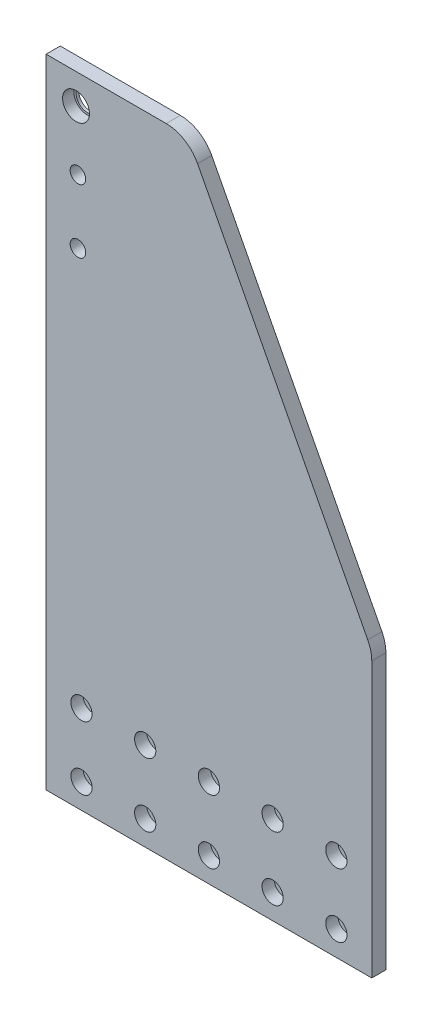
ISO-10303-21;
HEADER;
FILE_DESCRIPTION(('STEP AP214'),'2;1');
FILE_NAME('part.step','',(''),(''),'','','');
FILE_SCHEMA(('AUTOMOTIVE_DESIGN { 1 0 10303 214 1 1 1 1 }'));
ENDSEC;
DATA;
#1=APPLICATION_CONTEXT('core data for automotive mechanical design processes');
#2=APPLICATION_PROTOCOL_DEFINITION('international standard','automotive_design',2000,#1);
#3=PRODUCT_CONTEXT('',#1,'mechanical');
#4=PRODUCT('Part','Part','',(#3));
#5=PRODUCT_RELATED_PRODUCT_CATEGORY('part','',(#4));
#6=PRODUCT_DEFINITION_FORMATION('','',#4);
#7=PRODUCT_DEFINITION_CONTEXT('part definition',#1,'design');
#8=PRODUCT_DEFINITION('design','',#6,#7);
#9=PRODUCT_DEFINITION_SHAPE('','',#8);
#10=(LENGTH_UNIT() NAMED_UNIT(*) SI_UNIT(.MILLI.,.METRE.));
#11=(NAMED_UNIT(*) PLANE_ANGLE_UNIT() SI_UNIT($,.RADIAN.));
#12=(NAMED_UNIT(*) SI_UNIT($,.STERADIAN.) SOLID_ANGLE_UNIT());
#13=UNCERTAINTY_MEASURE_WITH_UNIT(LENGTH_MEASURE(1.E-05),#10,'distance_accuracy_value','');
#14=(GEOMETRIC_REPRESENTATION_CONTEXT(3) GLOBAL_UNCERTAINTY_ASSIGNED_CONTEXT((#13)) GLOBAL_UNIT_ASSIGNED_CONTEXT((#10,
#11,#12)) REPRESENTATION_CONTEXT('',''));
#15=CARTESIAN_POINT('',(0.,0.,0.));
#16=DIRECTION('',(0.,0.,1.));
#17=DIRECTION('',(1.,0.,0.));
#18=AXIS2_PLACEMENT_3D('',#15,#16,#17);
#19=CARTESIAN_POINT('',(-115.,0.,5.));
#20=DIRECTION('',(0.,1.,0.));
#21=DIRECTION('',(0.,0.,1.));
#22=AXIS2_PLACEMENT_3D('',#19,#20,#21);
#23=PLANE('',#22);
#24=DIRECTION('',(1.,0.,0.));
#25=VECTOR('',#24,1.);
#26=CARTESIAN_POINT('',(-115.,0.,-5.));
#27=LINE('',#26,#25);
#28=CARTESIAN_POINT('',(-115.,0.,-5.));
#29=VERTEX_POINT('',#28);
#30=CARTESIAN_POINT('',(115.,0.,-5.));
#31=VERTEX_POINT('',#30);
#32=EDGE_CURVE('E120',#29,#31,#27,.T.);
#33=ORIENTED_EDGE('',*,*,#32,.T.);
#34=DIRECTION('',(0.,0.,-1.));
#35=VECTOR('',#34,1.);
#36=CARTESIAN_POINT('',(115.,0.,5.));
#37=LINE('',#36,#35);
#38=CARTESIAN_POINT('',(115.,0.,5.));
#39=VERTEX_POINT('',#38);
#40=EDGE_CURVE('E104',#39,#31,#37,.T.);
#41=ORIENTED_EDGE('',*,*,#40,.F.);
#42=DIRECTION('',(1.,0.,0.));
#43=VECTOR('',#42,1.);
#44=CARTESIAN_POINT('',(-115.,0.,5.));
#45=LINE('',#44,#43);
#46=CARTESIAN_POINT('',(-115.,0.,5.));
#47=VERTEX_POINT('',#46);
#48=EDGE_CURVE('E108',#47,#39,#45,.T.);
#49=ORIENTED_EDGE('',*,*,#48,.F.);
#50=DIRECTION('',(0.,0.,-1.));
#51=VECTOR('',#50,1.);
#52=CARTESIAN_POINT('',(-115.,0.,5.));
#53=LINE('',#52,#51);
#54=EDGE_CURVE('E127',#47,#29,#53,.T.);
#55=ORIENTED_EDGE('',*,*,#54,.T.);
#56=EDGE_LOOP('',(#33,#41,#49,#55));
#57=FACE_BOUND('',#56,.T.);
#58=ADVANCED_FACE('F39',(#57),#23,.F.);
#59=CARTESIAN_POINT('',(115.,200.,5.));
#60=DIRECTION('',(-1.,0.,0.));
#61=DIRECTION('',(0.,-1.,0.));
#62=AXIS2_PLACEMENT_3D('',#59,#60,#61);
#63=PLANE('',#62);
#64=DIRECTION('',(0.,1.,0.));
#65=VECTOR('',#64,1.);
#66=CARTESIAN_POINT('',(115.,200.,-5.));
#67=LINE('',#66,#65);
#68=CARTESIAN_POINT('',(115.,193.888450755364,-5.));
#69=VERTEX_POINT('',#68);
#70=EDGE_CURVE('E289',#31,#69,#67,.T.);
#71=ORIENTED_EDGE('',*,*,#70,.T.);
#72=DIRECTION('',(0.,0.,-1.));
#73=VECTOR('',#72,1.);
#74=CARTESIAN_POINT('',(115.,193.888450755364,5.));
#75=LINE('',#74,#73);
#76=CARTESIAN_POINT('',(115.,193.888450755364,5.));
#77=VERTEX_POINT('',#76);
#78=EDGE_CURVE('E64',#69,#77,#75,.F.);
#79=ORIENTED_EDGE('',*,*,#78,.T.);
#80=DIRECTION('',(0.,1.,0.));
#81=VECTOR('',#80,1.);
#82=CARTESIAN_POINT('',(115.,200.,5.));
#83=LINE('',#82,#81);
#84=EDGE_CURVE('E100',#39,#77,#83,.T.);
#85=ORIENTED_EDGE('',*,*,#84,.F.);
#86=ORIENTED_EDGE('',*,*,#40,.T.);
#87=EDGE_LOOP('',(#71,#79,#85,#86));
#88=FACE_BOUND('',#87,.T.);
#89=ADVANCED_FACE('F102',(#88),#63,.F.);
#90=CARTESIAN_POINT('',(115.,200.,5.));
#91=DIRECTION('',(-0.887216801234595,-0.46135273664199,0.));
#92=DIRECTION('',(0.46135273664199,-0.887216801234595,0.));
#93=AXIS2_PLACEMENT_3D('',#90,#91,#92);
#94=PLANE('',#93);
#95=DIRECTION('',(-0.46135273664199,0.887216801234595,0.));
#96=VECTOR('',#95,1.);
#97=CARTESIAN_POINT('',(115.,200.,5.));
#98=LINE('',#97,#96);
#99=CARTESIAN_POINT('',(112.180420030865,205.422269171414,5.));
#100=VERTEX_POINT('',#99);
#101=CARTESIAN_POINT('',(-7.99758557634587,436.53381841605,5.));
#102=VERTEX_POINT('',#101);
#103=EDGE_CURVE('E107',#100,#102,#98,.T.);
#104=ORIENTED_EDGE('',*,*,#103,.F.);
#105=DIRECTION('',(0.,0.,-1.));
#106=VECTOR('',#105,1.);
#107=CARTESIAN_POINT('',(112.180420030865,205.422269171414,5.));
#108=LINE('',#107,#106);
#109=CARTESIAN_POINT('',(112.180420030865,205.422269171414,-5.));
#110=VERTEX_POINT('',#109);
#111=EDGE_CURVE('E124',#100,#110,#108,.T.);
#112=ORIENTED_EDGE('',*,*,#111,.T.);
#113=DIRECTION('',(-0.46135273664199,0.887216801234595,0.));
#114=VECTOR('',#113,1.);
#115=CARTESIAN_POINT('',(115.,200.,-5.));
#116=LINE('',#115,#114);
#117=CARTESIAN_POINT('',(-7.99758557634587,436.53381841605,-5.));
#118=VERTEX_POINT('',#117);
#119=EDGE_CURVE('E291',#110,#118,#116,.T.);
#120=ORIENTED_EDGE('',*,*,#119,.T.);
#121=DIRECTION('',(0.,0.,-1.));
#122=VECTOR('',#121,1.);
#123=CARTESIAN_POINT('',(-7.99758557634593,436.53381841605,5.));
#124=LINE('',#123,#122);
#125=EDGE_CURVE('E121',#118,#102,#124,.F.);
#126=ORIENTED_EDGE('',*,*,#125,.T.);
#127=EDGE_LOOP('',(#104,#112,#120,#126));
#128=FACE_BOUND('',#127,.T.);
#129=ADVANCED_FACE('F307',(#128),#94,.F.);
#130=CARTESIAN_POINT('',(-15.0000000000001,450.,5.));
#131=DIRECTION('',(0.,-1.,0.));
#132=DIRECTION('',(0.,0.,-1.));
#133=AXIS2_PLACEMENT_3D('',#130,#131,#132);
#134=PLANE('',#133);
#135=DIRECTION('',(-1.,0.,0.));
#136=VECTOR('',#135,1.);
#137=CARTESIAN_POINT('',(-15.0000000000001,450.,5.));
#138=LINE('',#137,#136);
#139=CARTESIAN_POINT('',(-30.1780056072108,450.,5.));
#140=VERTEX_POINT('',#139);
#141=CARTESIAN_POINT('',(-115.,450.,5.));
#142=VERTEX_POINT('',#141);
#143=EDGE_CURVE('E285',#140,#142,#138,.T.);
#144=ORIENTED_EDGE('',*,*,#143,.F.);
#145=DIRECTION('',(0.,0.,-1.));
#146=VECTOR('',#145,1.);
#147=CARTESIAN_POINT('',(-30.1780056072108,450.,5.));
#148=LINE('',#147,#146);
#149=CARTESIAN_POINT('',(-30.1780056072108,450.,-5.));
#150=VERTEX_POINT('',#149);
#151=EDGE_CURVE('E11',#140,#150,#148,.T.);
#152=ORIENTED_EDGE('',*,*,#151,.T.);
#153=DIRECTION('',(-1.,0.,0.));
#154=VECTOR('',#153,1.);
#155=CARTESIAN_POINT('',(-15.0000000000001,450.,-5.));
#156=LINE('',#155,#154);
#157=CARTESIAN_POINT('',(-115.,450.,-5.));
#158=VERTEX_POINT('',#157);
#159=EDGE_CURVE('E294',#150,#158,#156,.T.);
#160=ORIENTED_EDGE('',*,*,#159,.T.);
#161=DIRECTION('',(0.,0.,-1.));
#162=VECTOR('',#161,1.);
#163=CARTESIAN_POINT('',(-115.,450.,5.));
#164=LINE('',#163,#162);
#165=EDGE_CURVE('E122',#142,#158,#164,.T.);
#166=ORIENTED_EDGE('',*,*,#165,.F.);
#167=EDGE_LOOP('',(#144,#152,#160,#166));
#168=FACE_BOUND('',#167,.T.);
#169=ADVANCED_FACE('F312',(#168),#134,.F.);
#170=CARTESIAN_POINT('',(-115.,450.,5.));
#171=DIRECTION('',(1.,0.,0.));
#172=DIRECTION('',(0.,1.,0.));
#173=AXIS2_PLACEMENT_3D('',#170,#171,#172);
#174=PLANE('',#173);
#175=DIRECTION('',(0.,-1.,0.));
#176=VECTOR('',#175,1.);
#177=CARTESIAN_POINT('',(-115.,450.,-5.));
#178=LINE('',#177,#176);
#179=EDGE_CURVE('E117',#158,#29,#178,.T.);
#180=ORIENTED_EDGE('',*,*,#179,.T.);
#181=ORIENTED_EDGE('',*,*,#54,.F.);
#182=DIRECTION('',(0.,-1.,0.));
#183=VECTOR('',#182,1.);
#184=CARTESIAN_POINT('',(-115.,450.,5.));
#185=LINE('',#184,#183);
#186=EDGE_CURVE('E113',#142,#47,#185,.T.);
#187=ORIENTED_EDGE('',*,*,#186,.F.);
#188=ORIENTED_EDGE('',*,*,#165,.T.);
#189=EDGE_LOOP('',(#180,#181,#187,#188));
#190=FACE_BOUND('',#189,.T.);
#191=ADVANCED_FACE('F314',(#190),#174,.F.);
#192=CARTESIAN_POINT('',(0.,0.,5.));
#193=DIRECTION('',(0.,0.,-1.));
#194=DIRECTION('',(-1.,0.,0.));
#195=AXIS2_PLACEMENT_3D('',#192,#193,#194);
#196=PLANE('',#195);
#197=CARTESIAN_POINT('',(-92.5000000000001,387.5,5.));
#198=DIRECTION('',(0.,0.,1.));
#199=DIRECTION('',(1.,0.,0.));
#200=AXIS2_PLACEMENT_3D('',#197,#198,#199);
#201=CIRCLE('',#200,5.50000000000001);
#202=CARTESIAN_POINT('',(-87.,387.5,5.));
#203=VERTEX_POINT('',#202);
#204=EDGE_CURVE('E153',#203,#203,#201,.T.);
#205=ORIENTED_EDGE('',*,*,#204,.F.);
#206=EDGE_LOOP('',(#205));
#207=FACE_BOUND('',#206,.T.);
#208=CARTESIAN_POINT('',(-92.5000000000001,342.5,5.));
#209=DIRECTION('',(0.,0.,1.));
#210=DIRECTION('',(1.,0.,0.));
#211=AXIS2_PLACEMENT_3D('',#208,#209,#210);
#212=CIRCLE('',#211,5.50000000000001);
#213=CARTESIAN_POINT('',(-87.,342.5,5.));
#214=VERTEX_POINT('',#213);
#215=EDGE_CURVE('E142',#214,#214,#212,.T.);
#216=ORIENTED_EDGE('',*,*,#215,.F.);
#217=EDGE_LOOP('',(#216));
#218=FACE_BOUND('',#217,.T.);
#219=CARTESIAN_POINT('',(-93.8500000000001,428.85,5.));
#220=DIRECTION('',(0.,0.,1.));
#221=DIRECTION('',(1.,0.,0.));
#222=AXIS2_PLACEMENT_3D('',#219,#220,#221);
#223=CIRCLE('',#222,9.5);
#224=CARTESIAN_POINT('',(-84.3500000000001,428.85,5.));
#225=VERTEX_POINT('',#224);
#226=EDGE_CURVE('E157',#225,#225,#223,.T.);
#227=ORIENTED_EDGE('',*,*,#226,.F.);
#228=EDGE_LOOP('',(#227));
#229=FACE_BOUND('',#228,.T.);
#230=CARTESIAN_POINT('',(-90.,17.5,5.));
#231=DIRECTION('',(0.,0.,1.));
#232=DIRECTION('',(1.,0.,0.));
#233=AXIS2_PLACEMENT_3D('',#230,#231,#232);
#234=CIRCLE('',#233,7.50000000000001);
#235=CARTESIAN_POINT('',(-82.5,17.5,5.));
#236=VERTEX_POINT('',#235);
#237=EDGE_CURVE('E162',#236,#236,#234,.T.);
#238=ORIENTED_EDGE('',*,*,#237,.F.);
#239=EDGE_LOOP('',(#238));
#240=FACE_BOUND('',#239,.T.);
#241=CARTESIAN_POINT('',(-45.,17.5,5.));
#242=DIRECTION('',(0.,0.,1.));
#243=DIRECTION('',(1.,0.,0.));
#244=AXIS2_PLACEMENT_3D('',#241,#242,#243);
#245=CIRCLE('',#244,7.5);
#246=CARTESIAN_POINT('',(-37.5,17.5,5.));
#247=VERTEX_POINT('',#246);
#248=EDGE_CURVE('E176',#247,#247,#245,.T.);
#249=ORIENTED_EDGE('',*,*,#248,.F.);
#250=EDGE_LOOP('',(#249));
#251=FACE_BOUND('',#250,.T.);
#252=CARTESIAN_POINT('',(45.,17.5,5.));
#253=DIRECTION('',(0.,0.,1.));
#254=DIRECTION('',(1.,0.,0.));
#255=AXIS2_PLACEMENT_3D('',#252,#253,#254);
#256=CIRCLE('',#255,7.5);
#257=CARTESIAN_POINT('',(52.5,17.5,5.));
#258=VERTEX_POINT('',#257);
#259=EDGE_CURVE('E188',#258,#258,#256,.T.);
#260=ORIENTED_EDGE('',*,*,#259,.F.);
#261=EDGE_LOOP('',(#260));
#262=FACE_BOUND('',#261,.T.);
#263=CARTESIAN_POINT('',(90.,17.5,5.));
#264=DIRECTION('',(0.,0.,1.));
#265=DIRECTION('',(1.,0.,0.));
#266=AXIS2_PLACEMENT_3D('',#263,#264,#265);
#267=CIRCLE('',#266,7.50000000000001);
#268=CARTESIAN_POINT('',(97.5,17.5,5.));
#269=VERTEX_POINT('',#268);
#270=EDGE_CURVE('E200',#269,#269,#267,.T.);
#271=ORIENTED_EDGE('',*,*,#270,.F.);
#272=EDGE_LOOP('',(#271));
#273=FACE_BOUND('',#272,.T.);
#274=CARTESIAN_POINT('',(0.,17.5,5.));
#275=DIRECTION('',(0.,0.,1.));
#276=DIRECTION('',(1.,0.,0.));
#277=AXIS2_PLACEMENT_3D('',#274,#275,#276);
#278=CIRCLE('',#277,7.5);
#279=CARTESIAN_POINT('',(7.49999999999997,17.5,5.));
#280=VERTEX_POINT('',#279);
#281=EDGE_CURVE('E212',#280,#280,#278,.T.);
#282=ORIENTED_EDGE('',*,*,#281,.F.);
#283=EDGE_LOOP('',(#282));
#284=FACE_BOUND('',#283,.T.);
#285=CARTESIAN_POINT('',(-90.0000000000002,62.5,5.));
#286=DIRECTION('',(0.,0.,1.));
#287=DIRECTION('',(1.,0.,0.));
#288=AXIS2_PLACEMENT_3D('',#285,#286,#287);
#289=CIRCLE('',#288,7.49999999999999);
#290=CARTESIAN_POINT('',(-82.5000000000002,62.5,5.));
#291=VERTEX_POINT('',#290);
#292=EDGE_CURVE('E224',#291,#291,#289,.T.);
#293=ORIENTED_EDGE('',*,*,#292,.F.);
#294=EDGE_LOOP('',(#293));
#295=FACE_BOUND('',#294,.T.);
#296=CARTESIAN_POINT('',(-45.0000000000002,62.5,5.));
#297=DIRECTION('',(0.,0.,1.));
#298=DIRECTION('',(1.,0.,0.));
#299=AXIS2_PLACEMENT_3D('',#296,#297,#298);
#300=CIRCLE('',#299,7.5);
#301=CARTESIAN_POINT('',(-37.5000000000002,62.5,5.));
#302=VERTEX_POINT('',#301);
#303=EDGE_CURVE('E236',#302,#302,#300,.T.);
#304=ORIENTED_EDGE('',*,*,#303,.F.);
#305=EDGE_LOOP('',(#304));
#306=FACE_BOUND('',#305,.T.);
#307=CARTESIAN_POINT('',(44.9999999999998,62.5,5.));
#308=DIRECTION('',(0.,0.,1.));
#309=DIRECTION('',(1.,0.,0.));
#310=AXIS2_PLACEMENT_3D('',#307,#308,#309);
#311=CIRCLE('',#310,7.5);
#312=CARTESIAN_POINT('',(52.4999999999998,62.5,5.));
#313=VERTEX_POINT('',#312);
#314=EDGE_CURVE('E248',#313,#313,#311,.T.);
#315=ORIENTED_EDGE('',*,*,#314,.F.);
#316=EDGE_LOOP('',(#315));
#317=FACE_BOUND('',#316,.T.);
#318=CARTESIAN_POINT('',(89.9999999999998,62.5,5.));
#319=DIRECTION('',(0.,0.,1.));
#320=DIRECTION('',(1.,0.,0.));
#321=AXIS2_PLACEMENT_3D('',#318,#319,#320);
#322=CIRCLE('',#321,7.49999999999999);
#323=CARTESIAN_POINT('',(97.4999999999998,62.5,5.));
#324=VERTEX_POINT('',#323);
#325=EDGE_CURVE('E260',#324,#324,#322,.T.);
#326=ORIENTED_EDGE('',*,*,#325,.F.);
#327=EDGE_LOOP('',(#326));
#328=FACE_BOUND('',#327,.T.);
#329=CARTESIAN_POINT('',(-1.82116780565488E-13,62.5,5.));
#330=DIRECTION('',(0.,0.,1.));
#331=DIRECTION('',(1.,0.,0.));
#332=AXIS2_PLACEMENT_3D('',#329,#330,#331);
#333=CIRCLE('',#332,7.5);
#334=CARTESIAN_POINT('',(7.49999999999982,62.5,5.));
#335=VERTEX_POINT('',#334);
#336=EDGE_CURVE('E272',#335,#335,#333,.T.);
#337=ORIENTED_EDGE('',*,*,#336,.F.);
#338=EDGE_LOOP('',(#337));
#339=FACE_BOUND('',#338,.T.);
#340=ORIENTED_EDGE('',*,*,#84,.T.);
#341=CARTESIAN_POINT('',(90.0000000000001,193.888450755364,5.));
#342=DIRECTION('',(0.,0.,-1.));
#343=DIRECTION('',(-1.,0.,0.));
#344=AXIS2_PLACEMENT_3D('',#341,#342,#343);
#345=CIRCLE('',#344,25.);
#346=EDGE_CURVE('E48',#77,#100,#345,.F.);
#347=ORIENTED_EDGE('',*,*,#346,.T.);
#348=ORIENTED_EDGE('',*,*,#103,.T.);
#349=CARTESIAN_POINT('',(-30.1780056072108,425.,5.));
#350=DIRECTION('',(0.,0.,-1.));
#351=DIRECTION('',(-1.,0.,0.));
#352=AXIS2_PLACEMENT_3D('',#349,#350,#351);
#353=CIRCLE('',#352,25.);
#354=EDGE_CURVE('E56',#102,#140,#353,.F.);
#355=ORIENTED_EDGE('',*,*,#354,.T.);
#356=ORIENTED_EDGE('',*,*,#143,.T.);
#357=ORIENTED_EDGE('',*,*,#186,.T.);
#358=ORIENTED_EDGE('',*,*,#48,.T.);
#359=EDGE_LOOP('',(#340,#347,#348,#355,#356,#357,#358));
#360=FACE_BOUND('',#359,.T.);
#361=ADVANCED_FACE('F111',(#207,#218,#229,#240,#251,#262,#273,#284,#295,#306,#317,#328,#339,
#360),#196,.F.);
#362=CARTESIAN_POINT('',(0.,0.,-5.));
#363=DIRECTION('',(0.,0.,-1.));
#364=DIRECTION('',(-1.,0.,0.));
#365=AXIS2_PLACEMENT_3D('',#362,#363,#364);
#366=PLANE('',#365);
#367=CARTESIAN_POINT('',(-92.5000000000001,387.5,-5.));
#368=DIRECTION('',(0.,0.,-1.));
#369=DIRECTION('',(-1.,0.,0.));
#370=AXIS2_PLACEMENT_3D('',#367,#368,#369);
#371=CIRCLE('',#370,5.5);
#372=CARTESIAN_POINT('',(-98.0000000000001,387.5,-5.));
#373=VERTEX_POINT('',#372);
#374=EDGE_CURVE('E43',#373,#373,#371,.T.);
#375=ORIENTED_EDGE('',*,*,#374,.F.);
#376=EDGE_LOOP('',(#375));
#377=FACE_BOUND('',#376,.T.);
#378=CARTESIAN_POINT('',(-92.5000000000001,342.5,-5.));
#379=DIRECTION('',(0.,0.,-1.));
#380=DIRECTION('',(-1.,0.,0.));
#381=AXIS2_PLACEMENT_3D('',#378,#379,#380);
#382=CIRCLE('',#381,5.5);
#383=CARTESIAN_POINT('',(-98.0000000000001,342.5,-5.));
#384=VERTEX_POINT('',#383);
#385=EDGE_CURVE('E139',#384,#384,#382,.T.);
#386=ORIENTED_EDGE('',*,*,#385,.F.);
#387=EDGE_LOOP('',(#386));
#388=FACE_BOUND('',#387,.T.);
#389=CARTESIAN_POINT('',(-93.8500000000001,428.85,-5.));
#390=DIRECTION('',(0.,0.,1.));
#391=DIRECTION('',(1.,0.,0.));
#392=AXIS2_PLACEMENT_3D('',#389,#390,#391);
#393=CIRCLE('',#392,8.);
#394=CARTESIAN_POINT('',(-85.8500000000001,428.85,-5.));
#395=VERTEX_POINT('',#394);
#396=EDGE_CURVE('E146',#395,#395,#393,.T.);
#397=ORIENTED_EDGE('',*,*,#396,.T.);
#398=EDGE_LOOP('',(#397));
#399=FACE_BOUND('',#398,.T.);
#400=CARTESIAN_POINT('',(-90.,17.5,-5.));
#401=DIRECTION('',(0.,0.,1.));
#402=DIRECTION('',(1.,0.,0.));
#403=AXIS2_PLACEMENT_3D('',#400,#401,#402);
#404=CIRCLE('',#403,4.5);
#405=CARTESIAN_POINT('',(-85.5,17.5,-5.));
#406=VERTEX_POINT('',#405);
#407=EDGE_CURVE('E173',#406,#406,#404,.T.);
#408=ORIENTED_EDGE('',*,*,#407,.T.);
#409=EDGE_LOOP('',(#408));
#410=FACE_BOUND('',#409,.T.);
#411=CARTESIAN_POINT('',(-45.,17.5,-5.));
#412=DIRECTION('',(0.,0.,1.));
#413=DIRECTION('',(1.,0.,0.));
#414=AXIS2_PLACEMENT_3D('',#411,#412,#413);
#415=CIRCLE('',#414,4.5);
#416=CARTESIAN_POINT('',(-40.5,17.5,-5.));
#417=VERTEX_POINT('',#416);
#418=EDGE_CURVE('E185',#417,#417,#415,.T.);
#419=ORIENTED_EDGE('',*,*,#418,.T.);
#420=EDGE_LOOP('',(#419));
#421=FACE_BOUND('',#420,.T.);
#422=CARTESIAN_POINT('',(45.,17.5,-5.));
#423=DIRECTION('',(0.,0.,1.));
#424=DIRECTION('',(1.,0.,0.));
#425=AXIS2_PLACEMENT_3D('',#422,#423,#424);
#426=CIRCLE('',#425,4.5);
#427=CARTESIAN_POINT('',(49.5,17.5,-5.));
#428=VERTEX_POINT('',#427);
#429=EDGE_CURVE('E197',#428,#428,#426,.T.);
#430=ORIENTED_EDGE('',*,*,#429,.T.);
#431=EDGE_LOOP('',(#430));
#432=FACE_BOUND('',#431,.T.);
#433=CARTESIAN_POINT('',(90.,17.5,-5.));
#434=DIRECTION('',(0.,0.,1.));
#435=DIRECTION('',(1.,0.,0.));
#436=AXIS2_PLACEMENT_3D('',#433,#434,#435);
#437=CIRCLE('',#436,4.5);
#438=CARTESIAN_POINT('',(94.5,17.5,-5.));
#439=VERTEX_POINT('',#438);
#440=EDGE_CURVE('E209',#439,#439,#437,.T.);
#441=ORIENTED_EDGE('',*,*,#440,.T.);
#442=EDGE_LOOP('',(#441));
#443=FACE_BOUND('',#442,.T.);
#444=CARTESIAN_POINT('',(0.,17.5,-5.));
#445=DIRECTION('',(0.,0.,1.));
#446=DIRECTION('',(1.,0.,0.));
#447=AXIS2_PLACEMENT_3D('',#444,#445,#446);
#448=CIRCLE('',#447,4.5);
#449=CARTESIAN_POINT('',(4.49999999999997,17.5,-5.));
#450=VERTEX_POINT('',#449);
#451=EDGE_CURVE('E221',#450,#450,#448,.T.);
#452=ORIENTED_EDGE('',*,*,#451,.T.);
#453=EDGE_LOOP('',(#452));
#454=FACE_BOUND('',#453,.T.);
#455=CARTESIAN_POINT('',(-90.0000000000002,62.5,-5.));
#456=DIRECTION('',(0.,0.,1.));
#457=DIRECTION('',(1.,0.,0.));
#458=AXIS2_PLACEMENT_3D('',#455,#456,#457);
#459=CIRCLE('',#458,4.5);
#460=CARTESIAN_POINT('',(-85.5000000000002,62.5,-5.));
#461=VERTEX_POINT('',#460);
#462=EDGE_CURVE('E233',#461,#461,#459,.T.);
#463=ORIENTED_EDGE('',*,*,#462,.T.);
#464=EDGE_LOOP('',(#463));
#465=FACE_BOUND('',#464,.T.);
#466=CARTESIAN_POINT('',(-45.0000000000002,62.5,-5.));
#467=DIRECTION('',(0.,0.,1.));
#468=DIRECTION('',(1.,0.,0.));
#469=AXIS2_PLACEMENT_3D('',#466,#467,#468);
#470=CIRCLE('',#469,4.5);
#471=CARTESIAN_POINT('',(-40.5000000000002,62.5,-5.));
#472=VERTEX_POINT('',#471);
#473=EDGE_CURVE('E245',#472,#472,#470,.T.);
#474=ORIENTED_EDGE('',*,*,#473,.T.);
#475=EDGE_LOOP('',(#474));
#476=FACE_BOUND('',#475,.T.);
#477=CARTESIAN_POINT('',(44.9999999999998,62.5,-5.));
#478=DIRECTION('',(0.,0.,1.));
#479=DIRECTION('',(1.,0.,0.));
#480=AXIS2_PLACEMENT_3D('',#477,#478,#479);
#481=CIRCLE('',#480,4.5);
#482=CARTESIAN_POINT('',(49.4999999999998,62.5,-5.));
#483=VERTEX_POINT('',#482);
#484=EDGE_CURVE('E257',#483,#483,#481,.T.);
#485=ORIENTED_EDGE('',*,*,#484,.T.);
#486=EDGE_LOOP('',(#485));
#487=FACE_BOUND('',#486,.T.);
#488=CARTESIAN_POINT('',(89.9999999999998,62.5,-5.));
#489=DIRECTION('',(0.,0.,1.));
#490=DIRECTION('',(1.,0.,0.));
#491=AXIS2_PLACEMENT_3D('',#488,#489,#490);
#492=CIRCLE('',#491,4.5);
#493=CARTESIAN_POINT('',(94.4999999999998,62.5,-5.));
#494=VERTEX_POINT('',#493);
#495=EDGE_CURVE('E269',#494,#494,#492,.T.);
#496=ORIENTED_EDGE('',*,*,#495,.T.);
#497=EDGE_LOOP('',(#496));
#498=FACE_BOUND('',#497,.T.);
#499=CARTESIAN_POINT('',(-1.82116780565488E-13,62.5,-5.));
#500=DIRECTION('',(0.,0.,1.));
#501=DIRECTION('',(1.,0.,0.));
#502=AXIS2_PLACEMENT_3D('',#499,#500,#501);
#503=CIRCLE('',#502,4.5);
#504=CARTESIAN_POINT('',(4.49999999999982,62.5,-5.));
#505=VERTEX_POINT('',#504);
#506=EDGE_CURVE('E281',#505,#505,#503,.T.);
#507=ORIENTED_EDGE('',*,*,#506,.T.);
#508=EDGE_LOOP('',(#507));
#509=FACE_BOUND('',#508,.T.);
#510=ORIENTED_EDGE('',*,*,#119,.F.);
#511=CARTESIAN_POINT('',(90.0000000000001,193.888450755364,-5.));
#512=DIRECTION('',(0.,0.,-1.));
#513=DIRECTION('',(-1.,0.,0.));
#514=AXIS2_PLACEMENT_3D('',#511,#512,#513);
#515=CIRCLE('',#514,25.);
#516=EDGE_CURVE('E135',#110,#69,#515,.T.);
#517=ORIENTED_EDGE('',*,*,#516,.T.);
#518=ORIENTED_EDGE('',*,*,#70,.F.);
#519=ORIENTED_EDGE('',*,*,#32,.F.);
#520=ORIENTED_EDGE('',*,*,#179,.F.);
#521=ORIENTED_EDGE('',*,*,#159,.F.);
#522=CARTESIAN_POINT('',(-30.1780056072108,425.,-5.));
#523=DIRECTION('',(0.,0.,-1.));
#524=DIRECTION('',(-1.,0.,0.));
#525=AXIS2_PLACEMENT_3D('',#522,#523,#524);
#526=CIRCLE('',#525,25.);
#527=EDGE_CURVE('E133',#150,#118,#526,.T.);
#528=ORIENTED_EDGE('',*,*,#527,.T.);
#529=EDGE_LOOP('',(#510,#517,#518,#519,#520,#521,#528));
#530=FACE_BOUND('',#529,.T.);
#531=ADVANCED_FACE('F300',(#377,#388,#399,#410,#421,#432,#443,#454,#465,#476,#487,#498,#509,
#530),#366,.T.);
#532=CARTESIAN_POINT('',(-1.82116780565488E-13,62.5,5.));
#533=DIRECTION('',(0.,0.,1.));
#534=DIRECTION('',(1.,0.,0.));
#535=AXIS2_PLACEMENT_3D('',#532,#533,#534);
#536=CYLINDRICAL_SURFACE('',#535,4.5);
#537=ORIENTED_EDGE('',*,*,#506,.F.);
#538=EDGE_LOOP('',(#537));
#539=FACE_BOUND('',#538,.T.);
#540=CARTESIAN_POINT('',(-1.82116780565488E-13,62.5,-3.6));
#541=DIRECTION('',(0.,0.,1.));
#542=DIRECTION('',(1.,0.,0.));
#543=AXIS2_PLACEMENT_3D('',#540,#541,#542);
#544=CIRCLE('',#543,4.5);
#545=CARTESIAN_POINT('',(4.49999999999982,62.5,-3.6));
#546=VERTEX_POINT('',#545);
#547=EDGE_CURVE('E278',#546,#546,#544,.T.);
#548=ORIENTED_EDGE('',*,*,#547,.T.);
#549=EDGE_LOOP('',(#548));
#550=FACE_BOUND('',#549,.T.);
#551=ADVANCED_FACE('F471',(#539,#550),#536,.F.);
#552=CARTESIAN_POINT('',(4.49999999999982,62.5,-3.6));
#553=DIRECTION('',(0.,0.,-1.));
#554=DIRECTION('',(-1.,0.,0.));
#555=AXIS2_PLACEMENT_3D('',#552,#553,#554);
#556=PLANE('',#555);
#557=ORIENTED_EDGE('',*,*,#547,.F.);
#558=EDGE_LOOP('',(#557));
#559=FACE_BOUND('',#558,.T.);
#560=CARTESIAN_POINT('',(-1.82116780565488E-13,62.5,-3.6));
#561=DIRECTION('',(0.,0.,1.));
#562=DIRECTION('',(1.,0.,0.));
#563=AXIS2_PLACEMENT_3D('',#560,#561,#562);
#564=CIRCLE('',#563,7.5);
#565=CARTESIAN_POINT('',(7.49999999999982,62.5,-3.6));
#566=VERTEX_POINT('',#565);
#567=EDGE_CURVE('E275',#566,#566,#564,.T.);
#568=ORIENTED_EDGE('',*,*,#567,.T.);
#569=EDGE_LOOP('',(#568));
#570=FACE_BOUND('',#569,.T.);
#571=ADVANCED_FACE('F467',(#559,#570),#556,.F.);
#572=CARTESIAN_POINT('',(-1.82116780565488E-13,62.5,5.));
#573=DIRECTION('',(0.,0.,1.));
#574=DIRECTION('',(1.,0.,0.));
#575=AXIS2_PLACEMENT_3D('',#572,#573,#574);
#576=CYLINDRICAL_SURFACE('',#575,7.5);
#577=ORIENTED_EDGE('',*,*,#567,.F.);
#578=EDGE_LOOP('',(#577));
#579=FACE_BOUND('',#578,.T.);
#580=ORIENTED_EDGE('',*,*,#336,.T.);
#581=EDGE_LOOP('',(#580));
#582=FACE_BOUND('',#581,.T.);
#583=ADVANCED_FACE('F463',(#579,#582),#576,.F.);
#584=CARTESIAN_POINT('',(89.9999999999998,62.5,5.));
#585=DIRECTION('',(0.,0.,1.));
#586=DIRECTION('',(1.,0.,0.));
#587=AXIS2_PLACEMENT_3D('',#584,#585,#586);
#588=CYLINDRICAL_SURFACE('',#587,4.5);
#589=ORIENTED_EDGE('',*,*,#495,.F.);
#590=EDGE_LOOP('',(#589));
#591=FACE_BOUND('',#590,.T.);
#592=CARTESIAN_POINT('',(89.9999999999998,62.5,-3.6));
#593=DIRECTION('',(0.,0.,1.));
#594=DIRECTION('',(1.,0.,0.));
#595=AXIS2_PLACEMENT_3D('',#592,#593,#594);
#596=CIRCLE('',#595,4.5);
#597=CARTESIAN_POINT('',(94.4999999999998,62.5,-3.6));
#598=VERTEX_POINT('',#597);
#599=EDGE_CURVE('E266',#598,#598,#596,.T.);
#600=ORIENTED_EDGE('',*,*,#599,.T.);
#601=EDGE_LOOP('',(#600));
#602=FACE_BOUND('',#601,.T.);
#603=ADVANCED_FACE('F459',(#591,#602),#588,.F.);
#604=CARTESIAN_POINT('',(94.4999999999998,62.5,-3.6));
#605=DIRECTION('',(0.,0.,-1.));
#606=DIRECTION('',(-1.,0.,0.));
#607=AXIS2_PLACEMENT_3D('',#604,#605,#606);
#608=PLANE('',#607);
#609=ORIENTED_EDGE('',*,*,#599,.F.);
#610=EDGE_LOOP('',(#609));
#611=FACE_BOUND('',#610,.T.);
#612=CARTESIAN_POINT('',(89.9999999999998,62.5,-3.6));
#613=DIRECTION('',(0.,0.,1.));
#614=DIRECTION('',(1.,0.,0.));
#615=AXIS2_PLACEMENT_3D('',#612,#613,#614);
#616=CIRCLE('',#615,7.49999999999999);
#617=CARTESIAN_POINT('',(97.4999999999998,62.5,-3.6));
#618=VERTEX_POINT('',#617);
#619=EDGE_CURVE('E263',#618,#618,#616,.T.);
#620=ORIENTED_EDGE('',*,*,#619,.T.);
#621=EDGE_LOOP('',(#620));
#622=FACE_BOUND('',#621,.T.);
#623=ADVANCED_FACE('F455',(#611,#622),#608,.F.);
#624=CARTESIAN_POINT('',(89.9999999999998,62.5,5.));
#625=DIRECTION('',(0.,0.,1.));
#626=DIRECTION('',(1.,0.,0.));
#627=AXIS2_PLACEMENT_3D('',#624,#625,#626);
#628=CYLINDRICAL_SURFACE('',#627,7.49999999999999);
#629=ORIENTED_EDGE('',*,*,#619,.F.);
#630=EDGE_LOOP('',(#629));
#631=FACE_BOUND('',#630,.T.);
#632=ORIENTED_EDGE('',*,*,#325,.T.);
#633=EDGE_LOOP('',(#632));
#634=FACE_BOUND('',#633,.T.);
#635=ADVANCED_FACE('F451',(#631,#634),#628,.F.);
#636=CARTESIAN_POINT('',(44.9999999999998,62.5,5.));
#637=DIRECTION('',(0.,0.,1.));
#638=DIRECTION('',(1.,0.,0.));
#639=AXIS2_PLACEMENT_3D('',#636,#637,#638);
#640=CYLINDRICAL_SURFACE('',#639,4.5);
#641=ORIENTED_EDGE('',*,*,#484,.F.);
#642=EDGE_LOOP('',(#641));
#643=FACE_BOUND('',#642,.T.);
#644=CARTESIAN_POINT('',(44.9999999999998,62.5,-3.6));
#645=DIRECTION('',(0.,0.,1.));
#646=DIRECTION('',(1.,0.,0.));
#647=AXIS2_PLACEMENT_3D('',#644,#645,#646);
#648=CIRCLE('',#647,4.5);
#649=CARTESIAN_POINT('',(49.4999999999998,62.5,-3.6));
#650=VERTEX_POINT('',#649);
#651=EDGE_CURVE('E254',#650,#650,#648,.T.);
#652=ORIENTED_EDGE('',*,*,#651,.T.);
#653=EDGE_LOOP('',(#652));
#654=FACE_BOUND('',#653,.T.);
#655=ADVANCED_FACE('F447',(#643,#654),#640,.F.);
#656=CARTESIAN_POINT('',(49.4999999999998,62.5,-3.6));
#657=DIRECTION('',(0.,0.,-1.));
#658=DIRECTION('',(-1.,0.,0.));
#659=AXIS2_PLACEMENT_3D('',#656,#657,#658);
#660=PLANE('',#659);
#661=ORIENTED_EDGE('',*,*,#651,.F.);
#662=EDGE_LOOP('',(#661));
#663=FACE_BOUND('',#662,.T.);
#664=CARTESIAN_POINT('',(44.9999999999998,62.5,-3.6));
#665=DIRECTION('',(0.,0.,1.));
#666=DIRECTION('',(1.,0.,0.));
#667=AXIS2_PLACEMENT_3D('',#664,#665,#666);
#668=CIRCLE('',#667,7.5);
#669=CARTESIAN_POINT('',(52.4999999999998,62.5,-3.6));
#670=VERTEX_POINT('',#669);
#671=EDGE_CURVE('E251',#670,#670,#668,.T.);
#672=ORIENTED_EDGE('',*,*,#671,.T.);
#673=EDGE_LOOP('',(#672));
#674=FACE_BOUND('',#673,.T.);
#675=ADVANCED_FACE('F443',(#663,#674),#660,.F.);
#676=CARTESIAN_POINT('',(44.9999999999998,62.5,5.));
#677=DIRECTION('',(0.,0.,1.));
#678=DIRECTION('',(1.,0.,0.));
#679=AXIS2_PLACEMENT_3D('',#676,#677,#678);
#680=CYLINDRICAL_SURFACE('',#679,7.5);
#681=ORIENTED_EDGE('',*,*,#671,.F.);
#682=EDGE_LOOP('',(#681));
#683=FACE_BOUND('',#682,.T.);
#684=ORIENTED_EDGE('',*,*,#314,.T.);
#685=EDGE_LOOP('',(#684));
#686=FACE_BOUND('',#685,.T.);
#687=ADVANCED_FACE('F439',(#683,#686),#680,.F.);
#688=CARTESIAN_POINT('',(-45.0000000000002,62.5,5.));
#689=DIRECTION('',(0.,0.,1.));
#690=DIRECTION('',(1.,0.,0.));
#691=AXIS2_PLACEMENT_3D('',#688,#689,#690);
#692=CYLINDRICAL_SURFACE('',#691,4.5);
#693=ORIENTED_EDGE('',*,*,#473,.F.);
#694=EDGE_LOOP('',(#693));
#695=FACE_BOUND('',#694,.T.);
#696=CARTESIAN_POINT('',(-45.0000000000002,62.5,-3.6));
#697=DIRECTION('',(0.,0.,1.));
#698=DIRECTION('',(1.,0.,0.));
#699=AXIS2_PLACEMENT_3D('',#696,#697,#698);
#700=CIRCLE('',#699,4.5);
#701=CARTESIAN_POINT('',(-40.5000000000002,62.5,-3.6));
#702=VERTEX_POINT('',#701);
#703=EDGE_CURVE('E242',#702,#702,#700,.T.);
#704=ORIENTED_EDGE('',*,*,#703,.T.);
#705=EDGE_LOOP('',(#704));
#706=FACE_BOUND('',#705,.T.);
#707=ADVANCED_FACE('F435',(#695,#706),#692,.F.);
#708=CARTESIAN_POINT('',(-40.5000000000002,62.5,-3.6));
#709=DIRECTION('',(0.,0.,-1.));
#710=DIRECTION('',(-1.,0.,0.));
#711=AXIS2_PLACEMENT_3D('',#708,#709,#710);
#712=PLANE('',#711);
#713=ORIENTED_EDGE('',*,*,#703,.F.);
#714=EDGE_LOOP('',(#713));
#715=FACE_BOUND('',#714,.T.);
#716=CARTESIAN_POINT('',(-45.0000000000002,62.5,-3.6));
#717=DIRECTION('',(0.,0.,1.));
#718=DIRECTION('',(1.,0.,0.));
#719=AXIS2_PLACEMENT_3D('',#716,#717,#718);
#720=CIRCLE('',#719,7.5);
#721=CARTESIAN_POINT('',(-37.5000000000002,62.5,-3.6));
#722=VERTEX_POINT('',#721);
#723=EDGE_CURVE('E239',#722,#722,#720,.T.);
#724=ORIENTED_EDGE('',*,*,#723,.T.);
#725=EDGE_LOOP('',(#724));
#726=FACE_BOUND('',#725,.T.);
#727=ADVANCED_FACE('F431',(#715,#726),#712,.F.);
#728=CARTESIAN_POINT('',(-45.0000000000002,62.5,5.));
#729=DIRECTION('',(0.,0.,1.));
#730=DIRECTION('',(1.,0.,0.));
#731=AXIS2_PLACEMENT_3D('',#728,#729,#730);
#732=CYLINDRICAL_SURFACE('',#731,7.5);
#733=ORIENTED_EDGE('',*,*,#723,.F.);
#734=EDGE_LOOP('',(#733));
#735=FACE_BOUND('',#734,.T.);
#736=ORIENTED_EDGE('',*,*,#303,.T.);
#737=EDGE_LOOP('',(#736));
#738=FACE_BOUND('',#737,.T.);
#739=ADVANCED_FACE('F427',(#735,#738),#732,.F.);
#740=CARTESIAN_POINT('',(-90.0000000000002,62.5,5.));
#741=DIRECTION('',(0.,0.,1.));
#742=DIRECTION('',(1.,0.,0.));
#743=AXIS2_PLACEMENT_3D('',#740,#741,#742);
#744=CYLINDRICAL_SURFACE('',#743,4.5);
#745=ORIENTED_EDGE('',*,*,#462,.F.);
#746=EDGE_LOOP('',(#745));
#747=FACE_BOUND('',#746,.T.);
#748=CARTESIAN_POINT('',(-90.0000000000002,62.5,-3.6));
#749=DIRECTION('',(0.,0.,1.));
#750=DIRECTION('',(1.,0.,0.));
#751=AXIS2_PLACEMENT_3D('',#748,#749,#750);
#752=CIRCLE('',#751,4.5);
#753=CARTESIAN_POINT('',(-85.5000000000002,62.5,-3.6));
#754=VERTEX_POINT('',#753);
#755=EDGE_CURVE('E230',#754,#754,#752,.T.);
#756=ORIENTED_EDGE('',*,*,#755,.T.);
#757=EDGE_LOOP('',(#756));
#758=FACE_BOUND('',#757,.T.);
#759=ADVANCED_FACE('F423',(#747,#758),#744,.F.);
#760=CARTESIAN_POINT('',(-85.5000000000002,62.5,-3.6));
#761=DIRECTION('',(0.,0.,-1.));
#762=DIRECTION('',(-1.,0.,0.));
#763=AXIS2_PLACEMENT_3D('',#760,#761,#762);
#764=PLANE('',#763);
#765=ORIENTED_EDGE('',*,*,#755,.F.);
#766=EDGE_LOOP('',(#765));
#767=FACE_BOUND('',#766,.T.);
#768=CARTESIAN_POINT('',(-90.0000000000002,62.5,-3.6));
#769=DIRECTION('',(0.,0.,1.));
#770=DIRECTION('',(1.,0.,0.));
#771=AXIS2_PLACEMENT_3D('',#768,#769,#770);
#772=CIRCLE('',#771,7.49999999999999);
#773=CARTESIAN_POINT('',(-82.5000000000002,62.5,-3.6));
#774=VERTEX_POINT('',#773);
#775=EDGE_CURVE('E227',#774,#774,#772,.T.);
#776=ORIENTED_EDGE('',*,*,#775,.T.);
#777=EDGE_LOOP('',(#776));
#778=FACE_BOUND('',#777,.T.);
#779=ADVANCED_FACE('F419',(#767,#778),#764,.F.);
#780=CARTESIAN_POINT('',(-90.0000000000002,62.5,5.));
#781=DIRECTION('',(0.,0.,1.));
#782=DIRECTION('',(1.,0.,0.));
#783=AXIS2_PLACEMENT_3D('',#780,#781,#782);
#784=CYLINDRICAL_SURFACE('',#783,7.49999999999999);
#785=ORIENTED_EDGE('',*,*,#775,.F.);
#786=EDGE_LOOP('',(#785));
#787=FACE_BOUND('',#786,.T.);
#788=ORIENTED_EDGE('',*,*,#292,.T.);
#789=EDGE_LOOP('',(#788));
#790=FACE_BOUND('',#789,.T.);
#791=ADVANCED_FACE('F415',(#787,#790),#784,.F.);
#792=CARTESIAN_POINT('',(0.,17.5,5.));
#793=DIRECTION('',(0.,0.,1.));
#794=DIRECTION('',(1.,0.,0.));
#795=AXIS2_PLACEMENT_3D('',#792,#793,#794);
#796=CYLINDRICAL_SURFACE('',#795,4.5);
#797=ORIENTED_EDGE('',*,*,#451,.F.);
#798=EDGE_LOOP('',(#797));
#799=FACE_BOUND('',#798,.T.);
#800=CARTESIAN_POINT('',(0.,17.5,-3.6));
#801=DIRECTION('',(0.,0.,1.));
#802=DIRECTION('',(1.,0.,0.));
#803=AXIS2_PLACEMENT_3D('',#800,#801,#802);
#804=CIRCLE('',#803,4.5);
#805=CARTESIAN_POINT('',(4.49999999999997,17.5,-3.6));
#806=VERTEX_POINT('',#805);
#807=EDGE_CURVE('E218',#806,#806,#804,.T.);
#808=ORIENTED_EDGE('',*,*,#807,.T.);
#809=EDGE_LOOP('',(#808));
#810=FACE_BOUND('',#809,.T.);
#811=ADVANCED_FACE('F411',(#799,#810),#796,.F.);
#812=CARTESIAN_POINT('',(4.49999999999997,17.5,-3.6));
#813=DIRECTION('',(0.,0.,-1.));
#814=DIRECTION('',(-1.,0.,0.));
#815=AXIS2_PLACEMENT_3D('',#812,#813,#814);
#816=PLANE('',#815);
#817=ORIENTED_EDGE('',*,*,#807,.F.);
#818=EDGE_LOOP('',(#817));
#819=FACE_BOUND('',#818,.T.);
#820=CARTESIAN_POINT('',(0.,17.5,-3.6));
#821=DIRECTION('',(0.,0.,1.));
#822=DIRECTION('',(1.,0.,0.));
#823=AXIS2_PLACEMENT_3D('',#820,#821,#822);
#824=CIRCLE('',#823,7.5);
#825=CARTESIAN_POINT('',(7.49999999999997,17.5,-3.6));
#826=VERTEX_POINT('',#825);
#827=EDGE_CURVE('E215',#826,#826,#824,.T.);
#828=ORIENTED_EDGE('',*,*,#827,.T.);
#829=EDGE_LOOP('',(#828));
#830=FACE_BOUND('',#829,.T.);
#831=ADVANCED_FACE('F407',(#819,#830),#816,.F.);
#832=CARTESIAN_POINT('',(0.,17.5,5.));
#833=DIRECTION('',(0.,0.,1.));
#834=DIRECTION('',(1.,0.,0.));
#835=AXIS2_PLACEMENT_3D('',#832,#833,#834);
#836=CYLINDRICAL_SURFACE('',#835,7.5);
#837=ORIENTED_EDGE('',*,*,#827,.F.);
#838=EDGE_LOOP('',(#837));
#839=FACE_BOUND('',#838,.T.);
#840=ORIENTED_EDGE('',*,*,#281,.T.);
#841=EDGE_LOOP('',(#840));
#842=FACE_BOUND('',#841,.T.);
#843=ADVANCED_FACE('F403',(#839,#842),#836,.F.);
#844=CARTESIAN_POINT('',(90.,17.5,5.));
#845=DIRECTION('',(0.,0.,1.));
#846=DIRECTION('',(1.,0.,0.));
#847=AXIS2_PLACEMENT_3D('',#844,#845,#846);
#848=CYLINDRICAL_SURFACE('',#847,4.5);
#849=ORIENTED_EDGE('',*,*,#440,.F.);
#850=EDGE_LOOP('',(#849));
#851=FACE_BOUND('',#850,.T.);
#852=CARTESIAN_POINT('',(90.,17.5,-3.6));
#853=DIRECTION('',(0.,0.,1.));
#854=DIRECTION('',(1.,0.,0.));
#855=AXIS2_PLACEMENT_3D('',#852,#853,#854);
#856=CIRCLE('',#855,4.5);
#857=CARTESIAN_POINT('',(94.5,17.5,-3.6));
#858=VERTEX_POINT('',#857);
#859=EDGE_CURVE('E206',#858,#858,#856,.T.);
#860=ORIENTED_EDGE('',*,*,#859,.T.);
#861=EDGE_LOOP('',(#860));
#862=FACE_BOUND('',#861,.T.);
#863=ADVANCED_FACE('F399',(#851,#862),#848,.F.);
#864=CARTESIAN_POINT('',(94.5,17.5,-3.6));
#865=DIRECTION('',(0.,0.,-1.));
#866=DIRECTION('',(-1.,0.,0.));
#867=AXIS2_PLACEMENT_3D('',#864,#865,#866);
#868=PLANE('',#867);
#869=ORIENTED_EDGE('',*,*,#859,.F.);
#870=EDGE_LOOP('',(#869));
#871=FACE_BOUND('',#870,.T.);
#872=CARTESIAN_POINT('',(90.,17.5,-3.6));
#873=DIRECTION('',(0.,0.,1.));
#874=DIRECTION('',(1.,0.,0.));
#875=AXIS2_PLACEMENT_3D('',#872,#873,#874);
#876=CIRCLE('',#875,7.49999999999999);
#877=CARTESIAN_POINT('',(97.5,17.5,-3.6));
#878=VERTEX_POINT('',#877);
#879=EDGE_CURVE('E203',#878,#878,#876,.T.);
#880=ORIENTED_EDGE('',*,*,#879,.T.);
#881=EDGE_LOOP('',(#880));
#882=FACE_BOUND('',#881,.T.);
#883=ADVANCED_FACE('F395',(#871,#882),#868,.F.);
#884=CARTESIAN_POINT('',(90.,17.5,5.));
#885=DIRECTION('',(0.,0.,1.));
#886=DIRECTION('',(1.,0.,0.));
#887=AXIS2_PLACEMENT_3D('',#884,#885,#886);
#888=CYLINDRICAL_SURFACE('',#887,7.5);
#889=ORIENTED_EDGE('',*,*,#879,.F.);
#890=EDGE_LOOP('',(#889));
#891=FACE_BOUND('',#890,.T.);
#892=ORIENTED_EDGE('',*,*,#270,.T.);
#893=EDGE_LOOP('',(#892));
#894=FACE_BOUND('',#893,.T.);
#895=ADVANCED_FACE('F391',(#891,#894),#888,.F.);
#896=CARTESIAN_POINT('',(45.,17.5,5.));
#897=DIRECTION('',(0.,0.,1.));
#898=DIRECTION('',(1.,0.,0.));
#899=AXIS2_PLACEMENT_3D('',#896,#897,#898);
#900=CYLINDRICAL_SURFACE('',#899,4.5);
#901=ORIENTED_EDGE('',*,*,#429,.F.);
#902=EDGE_LOOP('',(#901));
#903=FACE_BOUND('',#902,.T.);
#904=CARTESIAN_POINT('',(45.,17.5,-3.6));
#905=DIRECTION('',(0.,0.,1.));
#906=DIRECTION('',(1.,0.,0.));
#907=AXIS2_PLACEMENT_3D('',#904,#905,#906);
#908=CIRCLE('',#907,4.5);
#909=CARTESIAN_POINT('',(49.5,17.5,-3.6));
#910=VERTEX_POINT('',#909);
#911=EDGE_CURVE('E194',#910,#910,#908,.T.);
#912=ORIENTED_EDGE('',*,*,#911,.T.);
#913=EDGE_LOOP('',(#912));
#914=FACE_BOUND('',#913,.T.);
#915=ADVANCED_FACE('F387',(#903,#914),#900,.F.);
#916=CARTESIAN_POINT('',(49.5,17.5,-3.6));
#917=DIRECTION('',(0.,0.,-1.));
#918=DIRECTION('',(-1.,0.,0.));
#919=AXIS2_PLACEMENT_3D('',#916,#917,#918);
#920=PLANE('',#919);
#921=ORIENTED_EDGE('',*,*,#911,.F.);
#922=EDGE_LOOP('',(#921));
#923=FACE_BOUND('',#922,.T.);
#924=CARTESIAN_POINT('',(45.,17.5,-3.6));
#925=DIRECTION('',(0.,0.,1.));
#926=DIRECTION('',(1.,0.,0.));
#927=AXIS2_PLACEMENT_3D('',#924,#925,#926);
#928=CIRCLE('',#927,7.5);
#929=CARTESIAN_POINT('',(52.5,17.5,-3.6));
#930=VERTEX_POINT('',#929);
#931=EDGE_CURVE('E191',#930,#930,#928,.T.);
#932=ORIENTED_EDGE('',*,*,#931,.T.);
#933=EDGE_LOOP('',(#932));
#934=FACE_BOUND('',#933,.T.);
#935=ADVANCED_FACE('F383',(#923,#934),#920,.F.);
#936=CARTESIAN_POINT('',(45.,17.5,5.));
#937=DIRECTION('',(0.,0.,1.));
#938=DIRECTION('',(1.,0.,0.));
#939=AXIS2_PLACEMENT_3D('',#936,#937,#938);
#940=CYLINDRICAL_SURFACE('',#939,7.5);
#941=ORIENTED_EDGE('',*,*,#931,.F.);
#942=EDGE_LOOP('',(#941));
#943=FACE_BOUND('',#942,.T.);
#944=ORIENTED_EDGE('',*,*,#259,.T.);
#945=EDGE_LOOP('',(#944));
#946=FACE_BOUND('',#945,.T.);
#947=ADVANCED_FACE('F379',(#943,#946),#940,.F.);
#948=CARTESIAN_POINT('',(-45.,17.5,5.));
#949=DIRECTION('',(0.,0.,1.));
#950=DIRECTION('',(1.,0.,0.));
#951=AXIS2_PLACEMENT_3D('',#948,#949,#950);
#952=CYLINDRICAL_SURFACE('',#951,4.5);
#953=ORIENTED_EDGE('',*,*,#418,.F.);
#954=EDGE_LOOP('',(#953));
#955=FACE_BOUND('',#954,.T.);
#956=CARTESIAN_POINT('',(-45.,17.5,-3.6));
#957=DIRECTION('',(0.,0.,1.));
#958=DIRECTION('',(1.,0.,0.));
#959=AXIS2_PLACEMENT_3D('',#956,#957,#958);
#960=CIRCLE('',#959,4.5);
#961=CARTESIAN_POINT('',(-40.5,17.5,-3.6));
#962=VERTEX_POINT('',#961);
#963=EDGE_CURVE('E182',#962,#962,#960,.T.);
#964=ORIENTED_EDGE('',*,*,#963,.T.);
#965=EDGE_LOOP('',(#964));
#966=FACE_BOUND('',#965,.T.);
#967=ADVANCED_FACE('F375',(#955,#966),#952,.F.);
#968=CARTESIAN_POINT('',(-40.5,17.5,-3.6));
#969=DIRECTION('',(0.,0.,-1.));
#970=DIRECTION('',(-1.,0.,0.));
#971=AXIS2_PLACEMENT_3D('',#968,#969,#970);
#972=PLANE('',#971);
#973=ORIENTED_EDGE('',*,*,#963,.F.);
#974=EDGE_LOOP('',(#973));
#975=FACE_BOUND('',#974,.T.);
#976=CARTESIAN_POINT('',(-45.,17.5,-3.6));
#977=DIRECTION('',(0.,0.,1.));
#978=DIRECTION('',(1.,0.,0.));
#979=AXIS2_PLACEMENT_3D('',#976,#977,#978);
#980=CIRCLE('',#979,7.5);
#981=CARTESIAN_POINT('',(-37.5,17.5,-3.6));
#982=VERTEX_POINT('',#981);
#983=EDGE_CURVE('E179',#982,#982,#980,.T.);
#984=ORIENTED_EDGE('',*,*,#983,.T.);
#985=EDGE_LOOP('',(#984));
#986=FACE_BOUND('',#985,.T.);
#987=ADVANCED_FACE('F371',(#975,#986),#972,.F.);
#988=CARTESIAN_POINT('',(-45.,17.5,5.));
#989=DIRECTION('',(0.,0.,1.));
#990=DIRECTION('',(1.,0.,0.));
#991=AXIS2_PLACEMENT_3D('',#988,#989,#990);
#992=CYLINDRICAL_SURFACE('',#991,7.5);
#993=ORIENTED_EDGE('',*,*,#983,.F.);
#994=EDGE_LOOP('',(#993));
#995=FACE_BOUND('',#994,.T.);
#996=ORIENTED_EDGE('',*,*,#248,.T.);
#997=EDGE_LOOP('',(#996));
#998=FACE_BOUND('',#997,.T.);
#999=ADVANCED_FACE('F367',(#995,#998),#992,.F.);
#1000=CARTESIAN_POINT('',(-90.,17.5,5.));
#1001=DIRECTION('',(0.,0.,1.));
#1002=DIRECTION('',(1.,0.,0.));
#1003=AXIS2_PLACEMENT_3D('',#1000,#1001,#1002);
#1004=CYLINDRICAL_SURFACE('',#1003,4.5);
#1005=ORIENTED_EDGE('',*,*,#407,.F.);
#1006=EDGE_LOOP('',(#1005));
#1007=FACE_BOUND('',#1006,.T.);
#1008=CARTESIAN_POINT('',(-90.,17.5,-3.6));
#1009=DIRECTION('',(0.,0.,1.));
#1010=DIRECTION('',(1.,0.,0.));
#1011=AXIS2_PLACEMENT_3D('',#1008,#1009,#1010);
#1012=CIRCLE('',#1011,4.5);
#1013=CARTESIAN_POINT('',(-85.5,17.5,-3.6));
#1014=VERTEX_POINT('',#1013);
#1015=EDGE_CURVE('E170',#1014,#1014,#1012,.T.);
#1016=ORIENTED_EDGE('',*,*,#1015,.T.);
#1017=EDGE_LOOP('',(#1016));
#1018=FACE_BOUND('',#1017,.T.);
#1019=ADVANCED_FACE('F363',(#1007,#1018),#1004,.F.);
#1020=CARTESIAN_POINT('',(-85.5,17.5,-3.6));
#1021=DIRECTION('',(0.,0.,-1.));
#1022=DIRECTION('',(-1.,0.,0.));
#1023=AXIS2_PLACEMENT_3D('',#1020,#1021,#1022);
#1024=PLANE('',#1023);
#1025=ORIENTED_EDGE('',*,*,#1015,.F.);
#1026=EDGE_LOOP('',(#1025));
#1027=FACE_BOUND('',#1026,.T.);
#1028=CARTESIAN_POINT('',(-90.,17.5,-3.6));
#1029=DIRECTION('',(0.,0.,1.));
#1030=DIRECTION('',(1.,0.,0.));
#1031=AXIS2_PLACEMENT_3D('',#1028,#1029,#1030);
#1032=CIRCLE('',#1031,7.49999999999999);
#1033=CARTESIAN_POINT('',(-82.5,17.5,-3.6));
#1034=VERTEX_POINT('',#1033);
#1035=EDGE_CURVE('E167',#1034,#1034,#1032,.T.);
#1036=ORIENTED_EDGE('',*,*,#1035,.T.);
#1037=EDGE_LOOP('',(#1036));
#1038=FACE_BOUND('',#1037,.T.);
#1039=ADVANCED_FACE('F359',(#1027,#1038),#1024,.F.);
#1040=CARTESIAN_POINT('',(-90.,17.5,5.));
#1041=DIRECTION('',(0.,0.,1.));
#1042=DIRECTION('',(1.,0.,0.));
#1043=AXIS2_PLACEMENT_3D('',#1040,#1041,#1042);
#1044=CYLINDRICAL_SURFACE('',#1043,7.5);
#1045=ORIENTED_EDGE('',*,*,#1035,.F.);
#1046=EDGE_LOOP('',(#1045));
#1047=FACE_BOUND('',#1046,.T.);
#1048=ORIENTED_EDGE('',*,*,#237,.T.);
#1049=EDGE_LOOP('',(#1048));
#1050=FACE_BOUND('',#1049,.T.);
#1051=ADVANCED_FACE('F355',(#1047,#1050),#1044,.F.);
#1052=CARTESIAN_POINT('',(-93.8500000000001,428.85,-3.));
#1053=DIRECTION('',(0.,0.,1.));
#1054=DIRECTION('',(1.,0.,0.));
#1055=AXIS2_PLACEMENT_3D('',#1052,#1053,#1054);
#1056=CYLINDRICAL_SURFACE('',#1055,9.5);
#1057=CARTESIAN_POINT('',(-93.8500000000001,428.85,-3.));
#1058=DIRECTION('',(0.,0.,1.));
#1059=DIRECTION('',(1.,0.,0.));
#1060=AXIS2_PLACEMENT_3D('',#1057,#1058,#1059);
#1061=CIRCLE('',#1060,9.5);
#1062=CARTESIAN_POINT('',(-84.3500000000001,428.85,-3.));
#1063=VERTEX_POINT('',#1062);
#1064=EDGE_CURVE('E159',#1063,#1063,#1061,.T.);
#1065=ORIENTED_EDGE('',*,*,#1064,.F.);
#1066=EDGE_LOOP('',(#1065));
#1067=FACE_BOUND('',#1066,.T.);
#1068=ORIENTED_EDGE('',*,*,#226,.T.);
#1069=EDGE_LOOP('',(#1068));
#1070=FACE_BOUND('',#1069,.T.);
#1071=ADVANCED_FACE('F345',(#1067,#1070),#1056,.F.);
#1072=CARTESIAN_POINT('',(-93.8500000000001,428.85,-3.));
#1073=DIRECTION('',(0.,0.,1.));
#1074=DIRECTION('',(1.,0.,0.));
#1075=AXIS2_PLACEMENT_3D('',#1072,#1073,#1074);
#1076=PLANE('',#1075);
#1077=CARTESIAN_POINT('',(-93.8500000000001,428.85,-3.));
#1078=DIRECTION('',(0.,0.,1.));
#1079=DIRECTION('',(1.,0.,0.));
#1080=AXIS2_PLACEMENT_3D('',#1077,#1078,#1079);
#1081=CIRCLE('',#1080,8.);
#1082=CARTESIAN_POINT('',(-85.8500000000001,428.85,-3.));
#1083=VERTEX_POINT('',#1082);
#1084=EDGE_CURVE('E141',#1083,#1083,#1081,.T.);
#1085=ORIENTED_EDGE('',*,*,#1084,.F.);
#1086=EDGE_LOOP('',(#1085));
#1087=FACE_BOUND('',#1086,.T.);
#1088=ORIENTED_EDGE('',*,*,#1064,.T.);
#1089=EDGE_LOOP('',(#1088));
#1090=FACE_BOUND('',#1089,.T.);
#1091=ADVANCED_FACE('F339',(#1087,#1090),#1076,.T.);
#1092=CARTESIAN_POINT('',(-93.8500000000001,428.85,-5.));
#1093=DIRECTION('',(0.,0.,1.));
#1094=DIRECTION('',(1.,0.,0.));
#1095=AXIS2_PLACEMENT_3D('',#1092,#1093,#1094);
#1096=CYLINDRICAL_SURFACE('',#1095,8.);
#1097=ORIENTED_EDGE('',*,*,#396,.F.);
#1098=EDGE_LOOP('',(#1097));
#1099=FACE_BOUND('',#1098,.T.);
#1100=ORIENTED_EDGE('',*,*,#1084,.T.);
#1101=EDGE_LOOP('',(#1100));
#1102=FACE_BOUND('',#1101,.T.);
#1103=ADVANCED_FACE('F333',(#1099,#1102),#1096,.F.);
#1104=CARTESIAN_POINT('',(90.0000000000001,193.888450755364,5.));
#1105=DIRECTION('',(0.,0.,-1.));
#1106=DIRECTION('',(-1.,0.,0.));
#1107=AXIS2_PLACEMENT_3D('',#1104,#1105,#1106);
#1108=CYLINDRICAL_SURFACE('',#1107,25.);
#1109=ORIENTED_EDGE('',*,*,#346,.F.);
#1110=ORIENTED_EDGE('',*,*,#78,.F.);
#1111=ORIENTED_EDGE('',*,*,#516,.F.);
#1112=ORIENTED_EDGE('',*,*,#111,.F.);
#1113=EDGE_LOOP('',(#1109,#1110,#1111,#1112));
#1114=FACE_BOUND('',#1113,.T.);
#1115=ADVANCED_FACE('F303',(#1114),#1108,.T.);
#1116=CARTESIAN_POINT('',(-30.1780056072108,425.,5.));
#1117=DIRECTION('',(0.,0.,-1.));
#1118=DIRECTION('',(-1.,0.,0.));
#1119=AXIS2_PLACEMENT_3D('',#1116,#1117,#1118);
#1120=CYLINDRICAL_SURFACE('',#1119,25.);
#1121=ORIENTED_EDGE('',*,*,#354,.F.);
#1122=ORIENTED_EDGE('',*,*,#125,.F.);
#1123=ORIENTED_EDGE('',*,*,#527,.F.);
#1124=ORIENTED_EDGE('',*,*,#151,.F.);
#1125=EDGE_LOOP('',(#1121,#1122,#1123,#1124));
#1126=FACE_BOUND('',#1125,.T.);
#1127=ADVANCED_FACE('F41',(#1126),#1120,.T.);
#1128=CARTESIAN_POINT('',(-92.5000000000001,342.5,5.));
#1129=DIRECTION('',(0.,0.,1.));
#1130=DIRECTION('',(1.,0.,0.));
#1131=AXIS2_PLACEMENT_3D('',#1128,#1129,#1130);
#1132=CYLINDRICAL_SURFACE('',#1131,5.5);
#1133=ORIENTED_EDGE('',*,*,#385,.T.);
#1134=EDGE_LOOP('',(#1133));
#1135=FACE_BOUND('',#1134,.T.);
#1136=ORIENTED_EDGE('',*,*,#215,.T.);
#1137=EDGE_LOOP('',(#1136));
#1138=FACE_BOUND('',#1137,.T.);
#1139=ADVANCED_FACE('F338',(#1135,#1138),#1132,.F.);
#1140=CARTESIAN_POINT('',(-92.5000000000001,387.5,5.));
#1141=DIRECTION('',(0.,0.,1.));
#1142=DIRECTION('',(1.,0.,0.));
#1143=AXIS2_PLACEMENT_3D('',#1140,#1141,#1142);
#1144=CYLINDRICAL_SURFACE('',#1143,5.5);
#1145=ORIENTED_EDGE('',*,*,#374,.T.);
#1146=EDGE_LOOP('',(#1145));
#1147=FACE_BOUND('',#1146,.T.);
#1148=ORIENTED_EDGE('',*,*,#204,.T.);
#1149=EDGE_LOOP('',(#1148));
#1150=FACE_BOUND('',#1149,.T.);
#1151=ADVANCED_FACE('F573',(#1147,#1150),#1144,.F.);
#1152=CLOSED_SHELL('',(#58,#89,#129,#169,#191,#361,#531,#551,#571,#583,#603,#623,#635,#655,#675,
#687,#707,#727,#739,#759,#779,#791,#811,#831,#843,#863,#883,#895,#915,#935,#947,#967,#987,#999,
#1019,#1039,#1051,#1071,#1091,#1103,#1115,#1127,#1139,#1151));
#1153=MANIFOLD_SOLID_BREP('B2',#1152);
#1154=ADVANCED_BREP_SHAPE_REPRESENTATION('',(#18,#1153),#14);
#1155=SHAPE_DEFINITION_REPRESENTATION(#9,#1154);
ENDSEC;
END-ISO-10303-21;
